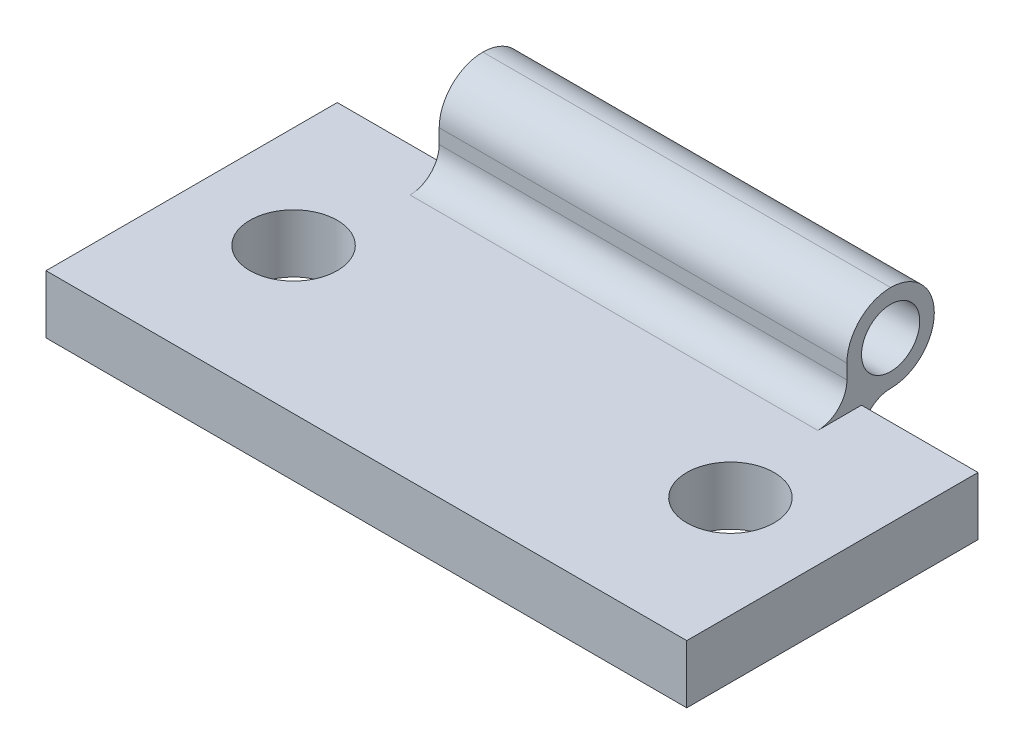
ISO-10303-21;
HEADER;
FILE_DESCRIPTION(('STEP AP214'),'2;1');
FILE_NAME('part.step','',(''),(''),'','','');
FILE_SCHEMA(('AUTOMOTIVE_DESIGN { 1 0 10303 214 1 1 1 1 }'));
ENDSEC;
DATA;
#1=APPLICATION_CONTEXT('core data for automotive mechanical design processes');
#2=APPLICATION_PROTOCOL_DEFINITION('international standard','automotive_design',2000,#1);
#3=PRODUCT_CONTEXT('',#1,'mechanical');
#4=PRODUCT('Part','Part','',(#3));
#5=PRODUCT_RELATED_PRODUCT_CATEGORY('part','',(#4));
#6=PRODUCT_DEFINITION_FORMATION('','',#4);
#7=PRODUCT_DEFINITION_CONTEXT('part definition',#1,'design');
#8=PRODUCT_DEFINITION('design','',#6,#7);
#9=PRODUCT_DEFINITION_SHAPE('','',#8);
#10=(LENGTH_UNIT() NAMED_UNIT(*) SI_UNIT(.MILLI.,.METRE.));
#11=(NAMED_UNIT(*) PLANE_ANGLE_UNIT() SI_UNIT($,.RADIAN.));
#12=(NAMED_UNIT(*) SI_UNIT($,.STERADIAN.) SOLID_ANGLE_UNIT());
#13=UNCERTAINTY_MEASURE_WITH_UNIT(LENGTH_MEASURE(1.E-05),#10,'distance_accuracy_value','');
#14=(GEOMETRIC_REPRESENTATION_CONTEXT(3) GLOBAL_UNCERTAINTY_ASSIGNED_CONTEXT((#13)) GLOBAL_UNIT_ASSIGNED_CONTEXT((#10,
#11,#12)) REPRESENTATION_CONTEXT('',''));
#15=CARTESIAN_POINT('',(0.,0.,0.));
#16=DIRECTION('',(0.,0.,1.));
#17=DIRECTION('',(1.,0.,0.));
#18=AXIS2_PLACEMENT_3D('',#15,#16,#17);
#19=CARTESIAN_POINT('',(0.,2.,0.));
#20=DIRECTION('',(0.,1.,0.));
#21=DIRECTION('',(0.,0.,1.));
#22=AXIS2_PLACEMENT_3D('',#19,#20,#21);
#23=PLANE('',#22);
#24=CARTESIAN_POINT('',(-7.5,2.,0.));
#25=DIRECTION('',(0.,1.,0.));
#26=DIRECTION('',(0.,0.,1.));
#27=AXIS2_PLACEMENT_3D('',#24,#25,#26);
#28=CIRCLE('',#27,1.5);
#29=CARTESIAN_POINT('',(-7.5,2.,1.5));
#30=VERTEX_POINT('',#29);
#31=EDGE_CURVE('E177',#30,#30,#28,.T.);
#32=ORIENTED_EDGE('',*,*,#31,.F.);
#33=EDGE_LOOP('',(#32));
#34=FACE_BOUND('',#33,.T.);
#35=CARTESIAN_POINT('',(7.5,2.,0.));
#36=DIRECTION('',(0.,1.,0.));
#37=DIRECTION('',(0.,0.,1.));
#38=AXIS2_PLACEMENT_3D('',#35,#36,#37);
#39=CIRCLE('',#38,1.5);
#40=CARTESIAN_POINT('',(7.5,2.,1.5));
#41=VERTEX_POINT('',#40);
#42=EDGE_CURVE('E284',#41,#41,#39,.T.);
#43=ORIENTED_EDGE('',*,*,#42,.F.);
#44=EDGE_LOOP('',(#43));
#45=FACE_BOUND('',#44,.T.);
#46=DIRECTION('',(-1.,0.,0.));
#47=VECTOR('',#46,1.);
#48=CARTESIAN_POINT('',(0.,2.,-3.5));
#49=LINE('',#48,#47);
#50=CARTESIAN_POINT('',(7.,2.,-3.5));
#51=VERTEX_POINT('',#50);
#52=CARTESIAN_POINT('',(-7.,2.,-3.5));
#53=VERTEX_POINT('',#52);
#54=EDGE_CURVE('E233',#51,#53,#49,.T.);
#55=ORIENTED_EDGE('',*,*,#54,.T.);
#56=DIRECTION('',(0.,0.,-1.));
#57=VECTOR('',#56,1.);
#58=CARTESIAN_POINT('',(-7.,2.,-7.5));
#59=LINE('',#58,#57);
#60=CARTESIAN_POINT('',(-7.,2.,-5.));
#61=VERTEX_POINT('',#60);
#62=EDGE_CURVE('E272',#53,#61,#59,.T.);
#63=ORIENTED_EDGE('',*,*,#62,.T.);
#64=DIRECTION('',(-1.,0.,0.));
#65=VECTOR('',#64,1.);
#66=CARTESIAN_POINT('',(-11.,2.,-5.));
#67=LINE('',#66,#65);
#68=CARTESIAN_POINT('',(-11.,2.,-5.));
#69=VERTEX_POINT('',#68);
#70=EDGE_CURVE('E160',#61,#69,#67,.T.);
#71=ORIENTED_EDGE('',*,*,#70,.T.);
#72=DIRECTION('',(0.,0.,1.));
#73=VECTOR('',#72,1.);
#74=CARTESIAN_POINT('',(-11.,2.,-5.));
#75=LINE('',#74,#73);
#76=CARTESIAN_POINT('',(-11.,2.,5.));
#77=VERTEX_POINT('',#76);
#78=EDGE_CURVE('E159',#69,#77,#75,.T.);
#79=ORIENTED_EDGE('',*,*,#78,.T.);
#80=DIRECTION('',(1.,0.,0.));
#81=VECTOR('',#80,1.);
#82=CARTESIAN_POINT('',(-11.,2.,5.));
#83=LINE('',#82,#81);
#84=CARTESIAN_POINT('',(11.,2.,5.));
#85=VERTEX_POINT('',#84);
#86=EDGE_CURVE('E164',#77,#85,#83,.T.);
#87=ORIENTED_EDGE('',*,*,#86,.T.);
#88=DIRECTION('',(0.,0.,-1.));
#89=VECTOR('',#88,1.);
#90=CARTESIAN_POINT('',(11.,2.,-5.));
#91=LINE('',#90,#89);
#92=CARTESIAN_POINT('',(11.,2.,-5.));
#93=VERTEX_POINT('',#92);
#94=EDGE_CURVE('E156',#85,#93,#91,.T.);
#95=ORIENTED_EDGE('',*,*,#94,.T.);
#96=CARTESIAN_POINT('',(7.,2.,-5.));
#97=VERTEX_POINT('',#96);
#98=EDGE_CURVE('E132',#93,#97,#67,.T.);
#99=ORIENTED_EDGE('',*,*,#98,.T.);
#100=DIRECTION('',(0.,0.,-1.));
#101=VECTOR('',#100,1.);
#102=CARTESIAN_POINT('',(7.,2.,-7.5));
#103=LINE('',#102,#101);
#104=EDGE_CURVE('E142',#51,#97,#103,.T.);
#105=ORIENTED_EDGE('',*,*,#104,.F.);
#106=EDGE_LOOP('',(#55,#63,#71,#79,#87,#95,#99,#105));
#107=FACE_BOUND('',#106,.T.);
#108=ADVANCED_FACE('F39',(#34,#45,#107),#23,.T.);
#109=CARTESIAN_POINT('',(0.,0.,0.));
#110=DIRECTION('',(0.,1.,0.));
#111=DIRECTION('',(0.,0.,1.));
#112=AXIS2_PLACEMENT_3D('',#109,#110,#111);
#113=PLANE('',#112);
#114=DIRECTION('',(0.,0.,-1.));
#115=VECTOR('',#114,1.);
#116=CARTESIAN_POINT('',(11.,0.,-5.));
#117=LINE('',#116,#115);
#118=CARTESIAN_POINT('',(11.,0.,5.));
#119=VERTEX_POINT('',#118);
#120=CARTESIAN_POINT('',(11.,0.,-5.));
#121=VERTEX_POINT('',#120);
#122=EDGE_CURVE('E172',#119,#121,#117,.T.);
#123=ORIENTED_EDGE('',*,*,#122,.F.);
#124=DIRECTION('',(1.,0.,0.));
#125=VECTOR('',#124,1.);
#126=CARTESIAN_POINT('',(-11.,0.,5.));
#127=LINE('',#126,#125);
#128=CARTESIAN_POINT('',(-11.,0.,5.));
#129=VERTEX_POINT('',#128);
#130=EDGE_CURVE('E183',#129,#119,#127,.T.);
#131=ORIENTED_EDGE('',*,*,#130,.F.);
#132=DIRECTION('',(0.,0.,1.));
#133=VECTOR('',#132,1.);
#134=CARTESIAN_POINT('',(-11.,0.,-5.));
#135=LINE('',#134,#133);
#136=CARTESIAN_POINT('',(-11.,0.,-5.));
#137=VERTEX_POINT('',#136);
#138=EDGE_CURVE('E180',#137,#129,#135,.T.);
#139=ORIENTED_EDGE('',*,*,#138,.F.);
#140=DIRECTION('',(-1.,0.,0.));
#141=VECTOR('',#140,1.);
#142=CARTESIAN_POINT('',(-11.,0.,-5.));
#143=LINE('',#142,#141);
#144=EDGE_CURVE('E176',#121,#137,#143,.T.);
#145=ORIENTED_EDGE('',*,*,#144,.F.);
#146=EDGE_LOOP('',(#123,#131,#139,#145));
#147=FACE_BOUND('',#146,.T.);
#148=CARTESIAN_POINT('',(-7.5,0.,0.));
#149=DIRECTION('',(0.,1.,0.));
#150=DIRECTION('',(0.,0.,1.));
#151=AXIS2_PLACEMENT_3D('',#148,#149,#150);
#152=CIRCLE('',#151,1.5);
#153=CARTESIAN_POINT('',(-7.5,0.,1.5));
#154=VERTEX_POINT('',#153);
#155=EDGE_CURVE('E288',#154,#154,#152,.T.);
#156=ORIENTED_EDGE('',*,*,#155,.T.);
#157=EDGE_LOOP('',(#156));
#158=FACE_BOUND('',#157,.T.);
#159=CARTESIAN_POINT('',(7.5,0.,0.));
#160=DIRECTION('',(0.,1.,0.));
#161=DIRECTION('',(0.,0.,1.));
#162=AXIS2_PLACEMENT_3D('',#159,#160,#161);
#163=CIRCLE('',#162,1.5);
#164=CARTESIAN_POINT('',(7.5,0.,1.5));
#165=VERTEX_POINT('',#164);
#166=EDGE_CURVE('E152',#165,#165,#163,.T.);
#167=ORIENTED_EDGE('',*,*,#166,.T.);
#168=EDGE_LOOP('',(#167));
#169=FACE_BOUND('',#168,.T.);
#170=ADVANCED_FACE('F298',(#147,#158,#169),#113,.F.);
#171=CARTESIAN_POINT('',(11.,2.,-5.));
#172=DIRECTION('',(-1.,0.,0.));
#173=DIRECTION('',(0.,0.,1.));
#174=AXIS2_PLACEMENT_3D('',#171,#172,#173);
#175=PLANE('',#174);
#176=ORIENTED_EDGE('',*,*,#122,.T.);
#177=DIRECTION('',(0.,-1.,0.));
#178=VECTOR('',#177,1.);
#179=CARTESIAN_POINT('',(11.,2.,-5.));
#180=LINE('',#179,#178);
#181=EDGE_CURVE('E197',#93,#121,#180,.T.);
#182=ORIENTED_EDGE('',*,*,#181,.F.);
#183=ORIENTED_EDGE('',*,*,#94,.F.);
#184=DIRECTION('',(0.,-1.,0.));
#185=VECTOR('',#184,1.);
#186=CARTESIAN_POINT('',(11.,2.,5.));
#187=LINE('',#186,#185);
#188=EDGE_CURVE('E171',#85,#119,#187,.T.);
#189=ORIENTED_EDGE('',*,*,#188,.T.);
#190=EDGE_LOOP('',(#176,#182,#183,#189));
#191=FACE_BOUND('',#190,.T.);
#192=ADVANCED_FACE('F324',(#191),#175,.F.);
#193=CARTESIAN_POINT('',(-11.,2.,-5.));
#194=DIRECTION('',(0.,0.,1.));
#195=DIRECTION('',(1.,0.,0.));
#196=AXIS2_PLACEMENT_3D('',#193,#194,#195);
#197=PLANE('',#196);
#198=ORIENTED_EDGE('',*,*,#70,.F.);
#199=DIRECTION('',(0.,-1.,0.));
#200=VECTOR('',#199,1.);
#201=CARTESIAN_POINT('',(-7.,0.,-5.));
#202=LINE('',#201,#200);
#203=CARTESIAN_POINT('',(-7.,1.,-5.));
#204=VERTEX_POINT('',#203);
#205=EDGE_CURVE('E55',#61,#204,#202,.T.);
#206=ORIENTED_EDGE('',*,*,#205,.T.);
#207=DIRECTION('',(-1.,0.,0.));
#208=VECTOR('',#207,1.);
#209=CARTESIAN_POINT('',(7.,1.,-5.));
#210=LINE('',#209,#208);
#211=CARTESIAN_POINT('',(7.,1.,-5.));
#212=VERTEX_POINT('',#211);
#213=EDGE_CURVE('E135',#204,#212,#210,.F.);
#214=ORIENTED_EDGE('',*,*,#213,.T.);
#215=DIRECTION('',(0.,1.,0.));
#216=VECTOR('',#215,1.);
#217=CARTESIAN_POINT('',(7.,2.,-5.));
#218=LINE('',#217,#216);
#219=EDGE_CURVE('E127',#212,#97,#218,.T.);
#220=ORIENTED_EDGE('',*,*,#219,.T.);
#221=ORIENTED_EDGE('',*,*,#98,.F.);
#222=ORIENTED_EDGE('',*,*,#181,.T.);
#223=ORIENTED_EDGE('',*,*,#144,.T.);
#224=DIRECTION('',(0.,-1.,0.));
#225=VECTOR('',#224,1.);
#226=CARTESIAN_POINT('',(-11.,2.,-5.));
#227=LINE('',#226,#225);
#228=EDGE_CURVE('E193',#69,#137,#227,.T.);
#229=ORIENTED_EDGE('',*,*,#228,.F.);
#230=EDGE_LOOP('',(#198,#206,#214,#220,#221,#222,#223,#229));
#231=FACE_BOUND('',#230,.T.);
#232=ADVANCED_FACE('F129',(#231),#197,.F.);
#233=CARTESIAN_POINT('',(-11.,2.,-5.));
#234=DIRECTION('',(1.,0.,0.));
#235=DIRECTION('',(0.,0.,-1.));
#236=AXIS2_PLACEMENT_3D('',#233,#234,#235);
#237=PLANE('',#236);
#238=ORIENTED_EDGE('',*,*,#138,.T.);
#239=DIRECTION('',(0.,-1.,0.));
#240=VECTOR('',#239,1.);
#241=CARTESIAN_POINT('',(-11.,2.,5.));
#242=LINE('',#241,#240);
#243=EDGE_CURVE('E189',#77,#129,#242,.T.);
#244=ORIENTED_EDGE('',*,*,#243,.F.);
#245=ORIENTED_EDGE('',*,*,#78,.F.);
#246=ORIENTED_EDGE('',*,*,#228,.T.);
#247=EDGE_LOOP('',(#238,#244,#245,#246));
#248=FACE_BOUND('',#247,.T.);
#249=ADVANCED_FACE('F313',(#248),#237,.F.);
#250=CARTESIAN_POINT('',(-11.,2.,5.));
#251=DIRECTION('',(0.,0.,-1.));
#252=DIRECTION('',(-1.,0.,0.));
#253=AXIS2_PLACEMENT_3D('',#250,#251,#252);
#254=PLANE('',#253);
#255=ORIENTED_EDGE('',*,*,#130,.T.);
#256=ORIENTED_EDGE('',*,*,#188,.F.);
#257=ORIENTED_EDGE('',*,*,#86,.F.);
#258=ORIENTED_EDGE('',*,*,#243,.T.);
#259=EDGE_LOOP('',(#255,#256,#257,#258));
#260=FACE_BOUND('',#259,.T.);
#261=ADVANCED_FACE('F304',(#260),#254,.F.);
#262=CARTESIAN_POINT('',(-7.5,2.,0.));
#263=DIRECTION('',(0.,-1.,0.));
#264=DIRECTION('',(0.,0.,-1.));
#265=AXIS2_PLACEMENT_3D('',#262,#263,#264);
#266=CYLINDRICAL_SURFACE('',#265,1.5);
#267=ORIENTED_EDGE('',*,*,#31,.T.);
#268=EDGE_LOOP('',(#267));
#269=FACE_BOUND('',#268,.T.);
#270=ORIENTED_EDGE('',*,*,#155,.F.);
#271=EDGE_LOOP('',(#270));
#272=FACE_BOUND('',#271,.T.);
#273=ADVANCED_FACE('F301',(#269,#272),#266,.F.);
#274=CARTESIAN_POINT('',(7.5,2.,0.));
#275=DIRECTION('',(0.,-1.,0.));
#276=DIRECTION('',(0.,0.,-1.));
#277=AXIS2_PLACEMENT_3D('',#274,#275,#276);
#278=CYLINDRICAL_SURFACE('',#277,1.5);
#279=ORIENTED_EDGE('',*,*,#42,.T.);
#280=EDGE_LOOP('',(#279));
#281=FACE_BOUND('',#280,.T.);
#282=ORIENTED_EDGE('',*,*,#166,.F.);
#283=EDGE_LOOP('',(#282));
#284=FACE_BOUND('',#283,.T.);
#285=ADVANCED_FACE('F303',(#281,#284),#278,.F.);
#286=CARTESIAN_POINT('',(7.,0.,0.));
#287=DIRECTION('',(1.,0.,0.));
#288=DIRECTION('',(0.,0.,-1.));
#289=AXIS2_PLACEMENT_3D('',#286,#287,#288);
#290=PLANE('',#289);
#291=CARTESIAN_POINT('',(7.,1.,-6.));
#292=DIRECTION('',(1.,0.,0.));
#293=DIRECTION('',(0.,0.,-1.));
#294=AXIS2_PLACEMENT_3D('',#291,#292,#293);
#295=CIRCLE('',#294,1.);
#296=CARTESIAN_POINT('',(7.,2.,-6.));
#297=VERTEX_POINT('',#296);
#298=EDGE_CURVE('E242',#212,#297,#295,.F.);
#299=ORIENTED_EDGE('',*,*,#298,.T.);
#300=CARTESIAN_POINT('',(7.,3.5,-6.));
#301=DIRECTION('',(1.,0.,0.));
#302=DIRECTION('',(0.,0.,-1.));
#303=AXIS2_PLACEMENT_3D('',#300,#301,#302);
#304=CIRCLE('',#303,1.5);
#305=CARTESIAN_POINT('',(7.,3.5,-7.5));
#306=VERTEX_POINT('',#305);
#307=EDGE_CURVE('E11',#297,#306,#304,.T.);
#308=ORIENTED_EDGE('',*,*,#307,.T.);
#309=CARTESIAN_POINT('',(7.,3.5,-6.));
#310=DIRECTION('',(1.,0.,0.));
#311=DIRECTION('',(0.,0.,-1.));
#312=AXIS2_PLACEMENT_3D('',#309,#310,#311);
#313=CIRCLE('',#312,1.5);
#314=CARTESIAN_POINT('',(7.,5.,-6.));
#315=VERTEX_POINT('',#314);
#316=EDGE_CURVE('E211',#306,#315,#313,.T.);
#317=ORIENTED_EDGE('',*,*,#316,.T.);
#318=CARTESIAN_POINT('',(7.,3.5,-6.));
#319=DIRECTION('',(1.,0.,0.));
#320=DIRECTION('',(0.,0.,-1.));
#321=AXIS2_PLACEMENT_3D('',#318,#319,#320);
#322=CIRCLE('',#321,1.5);
#323=CARTESIAN_POINT('',(7.,3.5,-4.5));
#324=VERTEX_POINT('',#323);
#325=EDGE_CURVE('E214',#315,#324,#322,.T.);
#326=ORIENTED_EDGE('',*,*,#325,.T.);
#327=DIRECTION('',(0.,-1.,0.));
#328=VECTOR('',#327,1.);
#329=CARTESIAN_POINT('',(7.,2.,-4.5));
#330=LINE('',#329,#328);
#331=CARTESIAN_POINT('',(7.,3.,-4.5));
#332=VERTEX_POINT('',#331);
#333=EDGE_CURVE('E153',#324,#332,#330,.T.);
#334=ORIENTED_EDGE('',*,*,#333,.T.);
#335=CARTESIAN_POINT('',(7.,3.,-3.5));
#336=DIRECTION('',(1.,0.,0.));
#337=DIRECTION('',(0.,0.,-1.));
#338=AXIS2_PLACEMENT_3D('',#335,#336,#337);
#339=CIRCLE('',#338,1.);
#340=EDGE_CURVE('E147',#332,#51,#339,.F.);
#341=ORIENTED_EDGE('',*,*,#340,.T.);
#342=ORIENTED_EDGE('',*,*,#104,.T.);
#343=ORIENTED_EDGE('',*,*,#219,.F.);
#344=EDGE_LOOP('',(#299,#308,#317,#326,#334,#341,#342,#343));
#345=FACE_BOUND('',#344,.T.);
#346=CARTESIAN_POINT('',(7.,3.5,-6.));
#347=DIRECTION('',(1.,0.,0.));
#348=DIRECTION('',(0.,0.,-1.));
#349=AXIS2_PLACEMENT_3D('',#346,#347,#348);
#350=CIRCLE('',#349,1.);
#351=CARTESIAN_POINT('',(7.,3.5,-7.));
#352=VERTEX_POINT('',#351);
#353=EDGE_CURVE('E282',#352,#352,#350,.T.);
#354=ORIENTED_EDGE('',*,*,#353,.F.);
#355=EDGE_LOOP('',(#354));
#356=FACE_BOUND('',#355,.T.);
#357=ADVANCED_FACE('F143',(#345,#356),#290,.T.);
#358=CARTESIAN_POINT('',(-7.,0.,0.));
#359=DIRECTION('',(1.,0.,0.));
#360=DIRECTION('',(0.,0.,-1.));
#361=AXIS2_PLACEMENT_3D('',#358,#359,#360);
#362=PLANE('',#361);
#363=CARTESIAN_POINT('',(-7.,3.5,-6.));
#364=DIRECTION('',(1.,0.,0.));
#365=DIRECTION('',(0.,0.,-1.));
#366=AXIS2_PLACEMENT_3D('',#363,#364,#365);
#367=CIRCLE('',#366,1.5);
#368=CARTESIAN_POINT('',(-7.,5.,-6.));
#369=VERTEX_POINT('',#368);
#370=CARTESIAN_POINT('',(-7.,3.5,-7.5));
#371=VERTEX_POINT('',#370);
#372=EDGE_CURVE('E204',#369,#371,#367,.F.);
#373=ORIENTED_EDGE('',*,*,#372,.T.);
#374=CARTESIAN_POINT('',(-7.,3.5,-6.));
#375=DIRECTION('',(1.,0.,0.));
#376=DIRECTION('',(0.,0.,-1.));
#377=AXIS2_PLACEMENT_3D('',#374,#375,#376);
#378=CIRCLE('',#377,1.5);
#379=CARTESIAN_POINT('',(-7.,2.,-6.));
#380=VERTEX_POINT('',#379);
#381=EDGE_CURVE('E48',#371,#380,#378,.F.);
#382=ORIENTED_EDGE('',*,*,#381,.T.);
#383=CARTESIAN_POINT('',(-7.,1.,-6.));
#384=DIRECTION('',(1.,0.,0.));
#385=DIRECTION('',(0.,0.,-1.));
#386=AXIS2_PLACEMENT_3D('',#383,#384,#385);
#387=CIRCLE('',#386,1.);
#388=EDGE_CURVE('E239',#380,#204,#387,.T.);
#389=ORIENTED_EDGE('',*,*,#388,.T.);
#390=ORIENTED_EDGE('',*,*,#205,.F.);
#391=ORIENTED_EDGE('',*,*,#62,.F.);
#392=CARTESIAN_POINT('',(-7.,3.,-3.5));
#393=DIRECTION('',(1.,0.,0.));
#394=DIRECTION('',(0.,0.,-1.));
#395=AXIS2_PLACEMENT_3D('',#392,#393,#394);
#396=CIRCLE('',#395,1.);
#397=CARTESIAN_POINT('',(-7.,3.,-4.5));
#398=VERTEX_POINT('',#397);
#399=EDGE_CURVE('E61',#53,#398,#396,.T.);
#400=ORIENTED_EDGE('',*,*,#399,.T.);
#401=DIRECTION('',(0.,-1.,0.));
#402=VECTOR('',#401,1.);
#403=CARTESIAN_POINT('',(-7.,2.,-4.5));
#404=LINE('',#403,#402);
#405=CARTESIAN_POINT('',(-7.,3.5,-4.5));
#406=VERTEX_POINT('',#405);
#407=EDGE_CURVE('E276',#406,#398,#404,.T.);
#408=ORIENTED_EDGE('',*,*,#407,.F.);
#409=CARTESIAN_POINT('',(-7.,3.5,-6.));
#410=DIRECTION('',(1.,0.,0.));
#411=DIRECTION('',(0.,0.,-1.));
#412=AXIS2_PLACEMENT_3D('',#409,#410,#411);
#413=CIRCLE('',#412,1.5);
#414=EDGE_CURVE('E208',#406,#369,#413,.F.);
#415=ORIENTED_EDGE('',*,*,#414,.T.);
#416=EDGE_LOOP('',(#373,#382,#389,#390,#391,#400,#408,#415));
#417=FACE_BOUND('',#416,.T.);
#418=CARTESIAN_POINT('',(-7.,3.5,-6.));
#419=DIRECTION('',(1.,0.,0.));
#420=DIRECTION('',(0.,0.,-1.));
#421=AXIS2_PLACEMENT_3D('',#418,#419,#420);
#422=CIRCLE('',#421,1.);
#423=CARTESIAN_POINT('',(-7.,3.5,-7.));
#424=VERTEX_POINT('',#423);
#425=EDGE_CURVE('E225',#424,#424,#422,.T.);
#426=ORIENTED_EDGE('',*,*,#425,.T.);
#427=EDGE_LOOP('',(#426));
#428=FACE_BOUND('',#427,.T.);
#429=ADVANCED_FACE('F250',(#417,#428),#362,.F.);
#430=CARTESIAN_POINT('',(7.,2.,-4.5));
#431=DIRECTION('',(0.,0.,-1.));
#432=DIRECTION('',(-1.,0.,0.));
#433=AXIS2_PLACEMENT_3D('',#430,#431,#432);
#434=PLANE('',#433);
#435=ORIENTED_EDGE('',*,*,#407,.T.);
#436=DIRECTION('',(-1.,0.,0.));
#437=VECTOR('',#436,1.);
#438=CARTESIAN_POINT('',(7.,3.,-4.5));
#439=LINE('',#438,#437);
#440=EDGE_CURVE('E236',#398,#332,#439,.F.);
#441=ORIENTED_EDGE('',*,*,#440,.T.);
#442=ORIENTED_EDGE('',*,*,#333,.F.);
#443=DIRECTION('',(-1.,0.,0.));
#444=VECTOR('',#443,1.);
#445=CARTESIAN_POINT('',(7.,3.5,-4.5));
#446=LINE('',#445,#444);
#447=EDGE_CURVE('E200',#324,#406,#446,.T.);
#448=ORIENTED_EDGE('',*,*,#447,.T.);
#449=EDGE_LOOP('',(#435,#441,#442,#448));
#450=FACE_BOUND('',#449,.T.);
#451=ADVANCED_FACE('F269',(#450),#434,.F.);
#452=CARTESIAN_POINT('',(7.,3.5,-6.));
#453=DIRECTION('',(-1.,0.,0.));
#454=DIRECTION('',(0.,0.,1.));
#455=AXIS2_PLACEMENT_3D('',#452,#453,#454);
#456=CYLINDRICAL_SURFACE('',#455,1.);
#457=ORIENTED_EDGE('',*,*,#353,.T.);
#458=EDGE_LOOP('',(#457));
#459=FACE_BOUND('',#458,.T.);
#460=ORIENTED_EDGE('',*,*,#425,.F.);
#461=EDGE_LOOP('',(#460));
#462=FACE_BOUND('',#461,.T.);
#463=ADVANCED_FACE('F341',(#459,#462),#456,.F.);
#464=CARTESIAN_POINT('',(7.,3.5,-6.));
#465=DIRECTION('',(-1.,0.,0.));
#466=DIRECTION('',(0.,0.,1.));
#467=AXIS2_PLACEMENT_3D('',#464,#465,#466);
#468=CYLINDRICAL_SURFACE('',#467,1.5);
#469=DIRECTION('',(-1.,0.,0.));
#470=VECTOR('',#469,1.);
#471=CARTESIAN_POINT('',(7.,5.,-6.));
#472=LINE('',#471,#470);
#473=EDGE_CURVE('E221',#315,#369,#472,.T.);
#474=ORIENTED_EDGE('',*,*,#473,.F.);
#475=ORIENTED_EDGE('',*,*,#316,.F.);
#476=DIRECTION('',(-1.,0.,0.));
#477=VECTOR('',#476,1.);
#478=CARTESIAN_POINT('',(7.,3.5,-7.5));
#479=LINE('',#478,#477);
#480=EDGE_CURVE('E217',#371,#306,#479,.F.);
#481=ORIENTED_EDGE('',*,*,#480,.F.);
#482=ORIENTED_EDGE('',*,*,#372,.F.);
#483=EDGE_LOOP('',(#474,#475,#481,#482));
#484=FACE_BOUND('',#483,.T.);
#485=ADVANCED_FACE('F262',(#484),#468,.T.);
#486=CARTESIAN_POINT('',(7.,3.5,-6.));
#487=DIRECTION('',(-1.,0.,0.));
#488=DIRECTION('',(0.,0.,1.));
#489=AXIS2_PLACEMENT_3D('',#486,#487,#488);
#490=CYLINDRICAL_SURFACE('',#489,1.5);
#491=ORIENTED_EDGE('',*,*,#325,.F.);
#492=ORIENTED_EDGE('',*,*,#473,.T.);
#493=ORIENTED_EDGE('',*,*,#414,.F.);
#494=ORIENTED_EDGE('',*,*,#447,.F.);
#495=EDGE_LOOP('',(#491,#492,#493,#494));
#496=FACE_BOUND('',#495,.T.);
#497=ADVANCED_FACE('F266',(#496),#490,.T.);
#498=CARTESIAN_POINT('',(7.,1.,-6.));
#499=DIRECTION('',(1.,0.,0.));
#500=DIRECTION('',(0.,0.,-1.));
#501=AXIS2_PLACEMENT_3D('',#498,#499,#500);
#502=CYLINDRICAL_SURFACE('',#501,1.);
#503=ORIENTED_EDGE('',*,*,#298,.F.);
#504=ORIENTED_EDGE('',*,*,#213,.F.);
#505=ORIENTED_EDGE('',*,*,#388,.F.);
#506=DIRECTION('',(-1.,0.,0.));
#507=VECTOR('',#506,1.);
#508=CARTESIAN_POINT('',(-7.,2.,-6.));
#509=LINE('',#508,#507);
#510=EDGE_CURVE('E139',#297,#380,#509,.T.);
#511=ORIENTED_EDGE('',*,*,#510,.F.);
#512=EDGE_LOOP('',(#503,#504,#505,#511));
#513=FACE_BOUND('',#512,.T.);
#514=ADVANCED_FACE('F257',(#513),#502,.F.);
#515=CARTESIAN_POINT('',(0.,3.,-3.5));
#516=DIRECTION('',(-1.,0.,0.));
#517=DIRECTION('',(0.,0.,1.));
#518=AXIS2_PLACEMENT_3D('',#515,#516,#517);
#519=CYLINDRICAL_SURFACE('',#518,1.);
#520=ORIENTED_EDGE('',*,*,#340,.F.);
#521=ORIENTED_EDGE('',*,*,#440,.F.);
#522=ORIENTED_EDGE('',*,*,#399,.F.);
#523=ORIENTED_EDGE('',*,*,#54,.F.);
#524=EDGE_LOOP('',(#520,#521,#522,#523));
#525=FACE_BOUND('',#524,.T.);
#526=ADVANCED_FACE('F343',(#525),#519,.F.);
#527=CARTESIAN_POINT('',(7.,3.5,-6.));
#528=DIRECTION('',(-1.,0.,0.));
#529=DIRECTION('',(0.,0.,1.));
#530=AXIS2_PLACEMENT_3D('',#527,#528,#529);
#531=CYLINDRICAL_SURFACE('',#530,1.5);
#532=ORIENTED_EDGE('',*,*,#307,.F.);
#533=ORIENTED_EDGE('',*,*,#510,.T.);
#534=ORIENTED_EDGE('',*,*,#381,.F.);
#535=ORIENTED_EDGE('',*,*,#480,.T.);
#536=EDGE_LOOP('',(#532,#533,#534,#535));
#537=FACE_BOUND('',#536,.T.);
#538=ADVANCED_FACE('F41',(#537),#531,.T.);
#539=CLOSED_SHELL('',(#108,#170,#192,#232,#249,#261,#273,#285,#357,#429,#451,#463,#485,#497,
#514,#526,#538));
#540=MANIFOLD_SOLID_BREP('B2',#539);
#541=ADVANCED_BREP_SHAPE_REPRESENTATION('',(#18,#540),#14);
#542=SHAPE_DEFINITION_REPRESENTATION(#9,#541);
ENDSEC;
END-ISO-10303-21;
